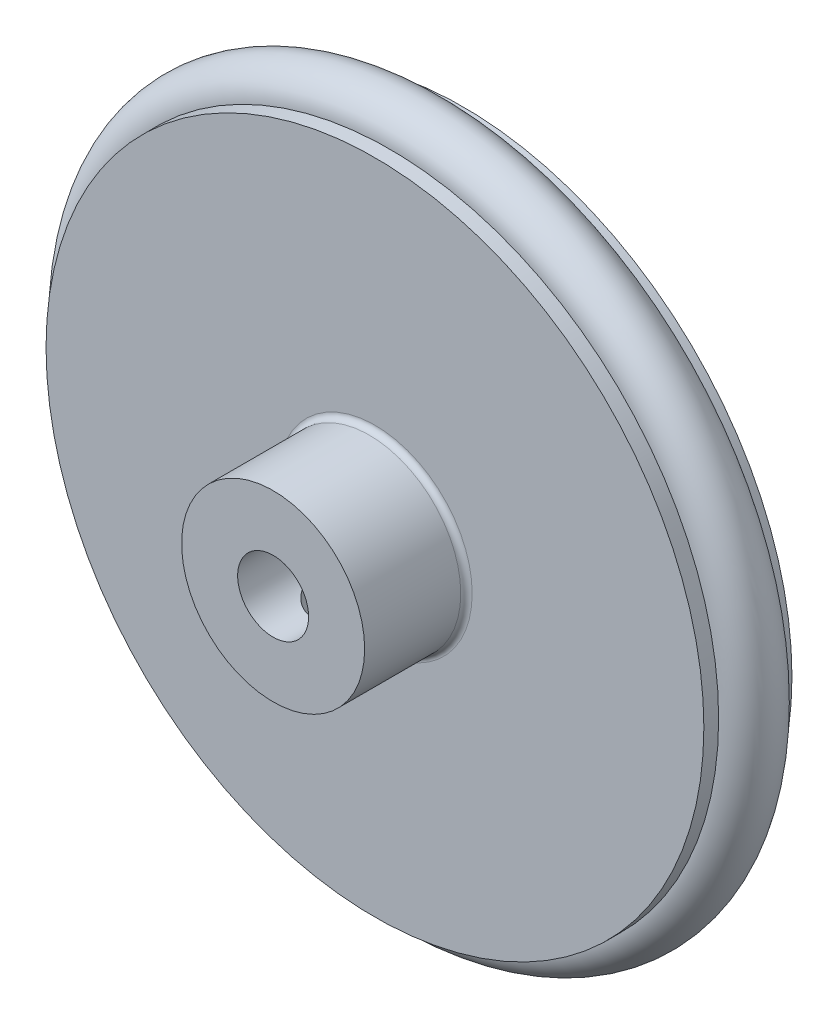
ISO-10303-21;
HEADER;
FILE_DESCRIPTION(('STEP AP214'),'2;1');
FILE_NAME('part.step','',(''),(''),'','','');
FILE_SCHEMA(('AUTOMOTIVE_DESIGN { 1 0 10303 214 1 1 1 1 }'));
ENDSEC;
DATA;
#1=APPLICATION_CONTEXT('core data for automotive mechanical design processes');
#2=APPLICATION_PROTOCOL_DEFINITION('international standard','automotive_design',2000,#1);
#3=PRODUCT_CONTEXT('',#1,'mechanical');
#4=PRODUCT('Part','Part','',(#3));
#5=PRODUCT_RELATED_PRODUCT_CATEGORY('part','',(#4));
#6=PRODUCT_DEFINITION_FORMATION('','',#4);
#7=PRODUCT_DEFINITION_CONTEXT('part definition',#1,'design');
#8=PRODUCT_DEFINITION('design','',#6,#7);
#9=PRODUCT_DEFINITION_SHAPE('','',#8);
#10=(LENGTH_UNIT() NAMED_UNIT(*) SI_UNIT(.MILLI.,.METRE.));
#11=(NAMED_UNIT(*) PLANE_ANGLE_UNIT() SI_UNIT($,.RADIAN.));
#12=(NAMED_UNIT(*) SI_UNIT($,.STERADIAN.) SOLID_ANGLE_UNIT());
#13=UNCERTAINTY_MEASURE_WITH_UNIT(LENGTH_MEASURE(1.E-05),#10,'distance_accuracy_value','');
#14=(GEOMETRIC_REPRESENTATION_CONTEXT(3) GLOBAL_UNCERTAINTY_ASSIGNED_CONTEXT((#13)) GLOBAL_UNIT_ASSIGNED_CONTEXT((#10,
#11,#12)) REPRESENTATION_CONTEXT('',''));
#15=CARTESIAN_POINT('',(0.,0.,0.));
#16=DIRECTION('',(0.,0.,1.));
#17=DIRECTION('',(1.,0.,0.));
#18=AXIS2_PLACEMENT_3D('',#15,#16,#17);
#19=CARTESIAN_POINT('',(0.,0.,0.));
#20=DIRECTION('',(0.,0.,-1.));
#21=DIRECTION('',(-1.,0.,0.));
#22=AXIS2_PLACEMENT_3D('',#19,#20,#21);
#23=TOROIDAL_SURFACE('',#22,28.75,2.56123692555145);
#24=CARTESIAN_POINT('',(28.75,0.,0.));
#25=DIRECTION('',(0.,1.,0.));
#26=DIRECTION('',(0.,0.,1.));
#27=AXIS2_PLACEMENT_3D('',#24,#25,#26);
#28=CIRCLE('',#27,2.56123692555145);
#29=CARTESIAN_POINT('',(31.3112369255514,0.,0.));
#30=VERTEX_POINT('',#29);
#31=EDGE_CURVE('E11',#30,#30,#28,.T.);
#32=CARTESIAN_POINT('',(0.,0.,0.));
#33=DIRECTION('',(0.,0.,-1.));
#34=DIRECTION('',(-1.,0.,0.));
#35=AXIS2_PLACEMENT_3D('',#32,#33,#34);
#36=CIRCLE('',#35,31.3112369255515);
#37=EDGE_CURVE('',#30,#30,#36,.T.);
#38=ORIENTED_EDGE('',*,*,#31,.F.);
#39=ORIENTED_EDGE('',*,*,#31,.T.);
#40=ORIENTED_EDGE('',*,*,#37,.T.);
#41=ORIENTED_EDGE('',*,*,#37,.F.);
#42=EDGE_LOOP('',(#38,#40,#39,#41));
#43=FACE_BOUND('',#42,.T.);
#44=ADVANCED_FACE('F52',(#43),#23,.T.);
#45=CLOSED_SHELL('',(#44));
#46=MANIFOLD_SOLID_BREP('B2',#45);
#47=CARTESIAN_POINT('',(0.,0.,3.85));
#48=DIRECTION('',(0.,0.,-1.));
#49=DIRECTION('',(-1.,0.,0.));
#50=AXIS2_PLACEMENT_3D('',#47,#48,#49);
#51=CYLINDRICAL_SURFACE('',#50,28.75);
#52=CARTESIAN_POINT('',(0.,0.,2.55));
#53=DIRECTION('',(0.,0.,-1.));
#54=DIRECTION('',(-1.,0.,0.));
#55=AXIS2_PLACEMENT_3D('',#52,#53,#54);
#56=CIRCLE('',#55,28.75);
#57=CARTESIAN_POINT('',(28.75,0.,2.55));
#58=VERTEX_POINT('',#57);
#59=EDGE_CURVE('E93',#58,#58,#56,.F.);
#60=ORIENTED_EDGE('',*,*,#59,.T.);
#61=EDGE_LOOP('',(#60));
#62=FACE_BOUND('',#61,.T.);
#63=CARTESIAN_POINT('',(0.,0.,3.85));
#64=DIRECTION('',(0.,0.,1.));
#65=DIRECTION('',(1.,0.,0.));
#66=AXIS2_PLACEMENT_3D('',#63,#64,#65);
#67=CIRCLE('',#66,28.75);
#68=CARTESIAN_POINT('',(28.75,0.,3.85));
#69=VERTEX_POINT('',#68);
#70=EDGE_CURVE('E101',#69,#69,#67,.T.);
#71=ORIENTED_EDGE('',*,*,#70,.F.);
#72=EDGE_LOOP('',(#71));
#73=FACE_BOUND('',#72,.T.);
#74=ADVANCED_FACE('F72',(#62,#73),#51,.T.);
#75=CARTESIAN_POINT('',(0.,0.,3.85));
#76=DIRECTION('',(0.,0.,1.));
#77=DIRECTION('',(1.,0.,0.));
#78=AXIS2_PLACEMENT_3D('',#75,#76,#77);
#79=PLANE('',#78);
#80=CARTESIAN_POINT('',(0.,0.,3.85));
#81=DIRECTION('',(0.,0.,1.));
#82=DIRECTION('',(1.,0.,0.));
#83=AXIS2_PLACEMENT_3D('',#80,#81,#82);
#84=CIRCLE('',#83,8.5);
#85=CARTESIAN_POINT('',(8.5,0.,3.85));
#86=VERTEX_POINT('',#85);
#87=EDGE_CURVE('E50',#86,#86,#84,.F.);
#88=ORIENTED_EDGE('',*,*,#87,.T.);
#89=EDGE_LOOP('',(#88));
#90=FACE_BOUND('',#89,.T.);
#91=ORIENTED_EDGE('',*,*,#70,.T.);
#92=EDGE_LOOP('',(#91));
#93=FACE_BOUND('',#92,.T.);
#94=ADVANCED_FACE('F153',(#90,#93),#79,.T.);
#95=CARTESIAN_POINT('',(0.,0.,0.));
#96=DIRECTION('',(0.,0.,1.));
#97=DIRECTION('',(1.,0.,0.));
#98=AXIS2_PLACEMENT_3D('',#95,#96,#97);
#99=TOROIDAL_SURFACE('',#98,28.75,2.55);
#100=CARTESIAN_POINT('',(28.75,0.,0.));
#101=DIRECTION('',(0.,1.,0.));
#102=DIRECTION('',(0.,0.,1.));
#103=AXIS2_PLACEMENT_3D('',#100,#101,#102);
#104=CIRCLE('',#103,2.55);
#105=CARTESIAN_POINT('',(28.75,0.,-2.55));
#106=VERTEX_POINT('',#105);
#107=EDGE_CURVE('E88',#106,#58,#104,.T.);
#108=ORIENTED_EDGE('',*,*,#107,.F.);
#109=CARTESIAN_POINT('',(0.,0.,-2.55));
#110=DIRECTION('',(0.,0.,1.));
#111=DIRECTION('',(1.,0.,0.));
#112=AXIS2_PLACEMENT_3D('',#109,#110,#111);
#113=CIRCLE('',#112,28.75);
#114=EDGE_CURVE('E91',#106,#106,#113,.F.);
#115=ORIENTED_EDGE('',*,*,#114,.F.);
#116=ORIENTED_EDGE('',*,*,#107,.T.);
#117=ORIENTED_EDGE('',*,*,#59,.F.);
#118=EDGE_LOOP('',(#108,#115,#116,#117));
#119=FACE_BOUND('',#118,.T.);
#120=ADVANCED_FACE('F89',(#119),#99,.F.);
#121=CARTESIAN_POINT('',(0.,0.,-3.85));
#122=DIRECTION('',(0.,0.,1.));
#123=DIRECTION('',(1.,0.,0.));
#124=AXIS2_PLACEMENT_3D('',#121,#122,#123);
#125=PLANE('',#124);
#126=CARTESIAN_POINT('',(0.,0.,-3.85));
#127=DIRECTION('',(0.,0.,1.));
#128=DIRECTION('',(1.,0.,0.));
#129=AXIS2_PLACEMENT_3D('',#126,#127,#128);
#130=CIRCLE('',#129,28.75);
#131=CARTESIAN_POINT('',(28.75,0.,-3.85));
#132=VERTEX_POINT('',#131);
#133=EDGE_CURVE('E95',#132,#132,#130,.T.);
#134=ORIENTED_EDGE('',*,*,#133,.F.);
#135=EDGE_LOOP('',(#134));
#136=FACE_BOUND('',#135,.T.);
#137=ADVANCED_FACE('F152',(#136),#125,.F.);
#138=ORIENTED_EDGE('',*,*,#114,.T.);
#139=EDGE_LOOP('',(#138));
#140=FACE_BOUND('',#139,.T.);
#141=ORIENTED_EDGE('',*,*,#133,.T.);
#142=EDGE_LOOP('',(#141));
#143=FACE_BOUND('',#142,.T.);
#144=ADVANCED_FACE('F148',(#140,#143),#51,.T.);
#145=CARTESIAN_POINT('',(0.,0.,12.75));
#146=DIRECTION('',(0.,0.,-1.));
#147=DIRECTION('',(-1.,0.,0.));
#148=AXIS2_PLACEMENT_3D('',#145,#146,#147);
#149=CYLINDRICAL_SURFACE('',#148,8.);
#150=CARTESIAN_POINT('',(0.,0.,4.35));
#151=DIRECTION('',(0.,0.,1.));
#152=DIRECTION('',(1.,0.,0.));
#153=AXIS2_PLACEMENT_3D('',#150,#151,#152);
#154=CIRCLE('',#153,8.);
#155=CARTESIAN_POINT('',(8.,0.,4.35));
#156=VERTEX_POINT('',#155);
#157=EDGE_CURVE('E81',#156,#156,#154,.T.);
#158=ORIENTED_EDGE('',*,*,#157,.T.);
#159=EDGE_LOOP('',(#158));
#160=FACE_BOUND('',#159,.T.);
#161=CARTESIAN_POINT('',(0.,-8.,9.5));
#162=CARTESIAN_POINT('',(0.110501451559641,-7.9999981315735,9.49999689901579));
#163=CARTESIAN_POINT('',(0.221037543774351,-7.99768770842435,9.49081126563495));
#164=CARTESIAN_POINT('',(0.438941765027377,-7.98869485106526,9.45436646492399));
#165=CARTESIAN_POINT('',(0.546308062494319,-7.98200993893301,9.42709705394953));
#166=CARTESIAN_POINT('',(0.754694496243435,-7.96500835109376,9.35541432871722));
#167=CARTESIAN_POINT('',(0.855722084573336,-7.95469603789411,9.31102160171297));
#168=CARTESIAN_POINT('',(1.04889617587257,-7.93153791743495,9.20642481327354));
#169=CARTESIAN_POINT('',(1.14104237913168,-7.91869202472209,9.14622021850805));
#170=CARTESIAN_POINT('',(1.31573590306789,-7.89156551455591,9.01039894712776));
#171=CARTESIAN_POINT('',(1.39807425341474,-7.87726276197502,8.93451790005459));
#172=CARTESIAN_POINT('',(1.54899856960443,-7.84898160157248,8.77006372678795));
#173=CARTESIAN_POINT('',(1.61758298259892,-7.83500323053157,8.68148916940408));
#174=CARTESIAN_POINT('',(1.74003539039863,-7.80873034264225,8.49253969768401));
#175=CARTESIAN_POINT('',(1.79366962123352,-7.79646392619748,8.39200902558836));
#176=CARTESIAN_POINT('',(1.88319587806766,-7.77532659757355,8.18300211778662));
#177=CARTESIAN_POINT('',(1.91909074058685,-7.76645514259225,8.07452715555731));
#178=CARTESIAN_POINT('',(1.97140644907302,-7.7533396892843,7.85500866906446));
#179=CARTESIAN_POINT('',(1.98820302444274,-7.74900654662681,7.74406013861601));
#180=CARTESIAN_POINT('',(2.00301570008854,-7.74519149946122,7.52084190800087));
#181=CARTESIAN_POINT('',(2.00103485575748,-7.74570880570571,7.40857242574382));
#182=CARTESIAN_POINT('',(1.97864869951961,-7.75145607355756,7.1887789230062));
#183=CARTESIAN_POINT('',(1.95869112025418,-7.75657150676391,7.08120583804623));
#184=CARTESIAN_POINT('',(1.90163224920399,-7.77075612894758,6.87098526545192));
#185=CARTESIAN_POINT('',(1.86452973609252,-7.77982559958985,6.76833812929477));
#186=CARTESIAN_POINT('',(1.77385263724958,-7.80100151874212,6.56968264499716));
#187=CARTESIAN_POINT('',(1.72011555631056,-7.81313769959755,6.47375177094724));
#188=CARTESIAN_POINT('',(1.59780836801993,-7.83906281127988,6.29210838699091));
#189=CARTESIAN_POINT('',(1.52923566507845,-7.85285203112837,6.20639766924367));
#190=CARTESIAN_POINT('',(1.37688456624163,-7.88101174053188,6.04506184574079));
#191=CARTESIAN_POINT('',(1.29272834422115,-7.89538759304001,5.96979401325153));
#192=CARTESIAN_POINT('',(1.11281589000493,-7.92274620771675,5.8343716767148));
#193=CARTESIAN_POINT('',(1.01705930361059,-7.93572892732543,5.77421763431525));
#194=CARTESIAN_POINT('',(0.816154518241855,-7.9589030945892,5.67059921836749));
#195=CARTESIAN_POINT('',(0.710975190944831,-7.96908480170303,5.62719287966076));
#196=CARTESIAN_POINT('',(0.49450134419051,-7.98543889321888,5.55877692572057));
#197=CARTESIAN_POINT('',(0.383207998867312,-7.99161204452374,5.53376379144248));
#198=CARTESIAN_POINT('',(0.160719960520035,-7.999139990285,5.50338991258822));
#199=CARTESIAN_POINT('',(0.0495956266509452,-8.00061404677705,5.4975426318996));
#200=CARTESIAN_POINT('',(-0.172043833068678,-7.99891739752601,5.50433200274065));
#201=CARTESIAN_POINT('',(-0.282559012859461,-7.99574710989128,5.51696699039884));
#202=CARTESIAN_POINT('',(-0.498152358368656,-7.98519441503143,5.55996121118851));
#203=CARTESIAN_POINT('',(-0.603286825291673,-7.97787512247748,5.59005501796932));
#204=CARTESIAN_POINT('',(-0.807009723270016,-7.95984942178845,5.66680944537126));
#205=CARTESIAN_POINT('',(-0.905597492043513,-7.94914267159856,5.71347173908423));
#206=CARTESIAN_POINT('',(-1.0953641792398,-7.92524410568414,5.82298150516631));
#207=CARTESIAN_POINT('',(-1.18638058911444,-7.91201156489243,5.88610148319569));
#208=CARTESIAN_POINT('',(-1.35670215152433,-7.88459345583226,6.02638654506263));
#209=CARTESIAN_POINT('',(-1.43600527863068,-7.87040772335606,6.10355405282254));
#210=CARTESIAN_POINT('',(-1.58265409076364,-7.84225275947695,6.27200261445929));
#211=CARTESIAN_POINT('',(-1.64965849016271,-7.82829738916375,6.36358360400323));
#212=CARTESIAN_POINT('',(-1.7673476786836,-7.80257171169652,6.55697684595429));
#213=CARTESIAN_POINT('',(-1.81803319221058,-7.79080130756035,6.65878864394634));
#214=CARTESIAN_POINT('',(-1.90126856081239,-7.77090792979553,6.86920762988411));
#215=CARTESIAN_POINT('',(-1.93392586220542,-7.76276340389207,6.97777017112535));
#216=CARTESIAN_POINT('',(-1.98046087993837,-7.75102325453578,7.19907951718548));
#217=CARTESIAN_POINT('',(-1.99434270330488,-7.74742663626581,7.31182540137666));
#218=CARTESIAN_POINT('',(-2.00271812044533,-7.74526534938609,7.53482803180694));
#219=CARTESIAN_POINT('',(-1.99775719704016,-7.74655910304352,7.64506324683298));
#220=CARTESIAN_POINT('',(-1.96983637108382,-7.7537054534379,7.86307185155731));
#221=CARTESIAN_POINT('',(-1.94687683024903,-7.75955795855809,7.97084529068487));
#222=CARTESIAN_POINT('',(-1.88390842592373,-7.77508347576963,8.18027794542055));
#223=CARTESIAN_POINT('',(-1.84400187290717,-7.78473353648412,8.28196974032028));
#224=CARTESIAN_POINT('',(-1.74835321814009,-7.80677007633105,8.47728717695159));
#225=CARTESIAN_POINT('',(-1.69260892004558,-7.81915693494364,8.57091169758256));
#226=CARTESIAN_POINT('',(-1.56515699818285,-7.8456751235135,8.75007283866936));
#227=CARTESIAN_POINT('',(-1.493070883883,-7.85984353109009,8.83533476456528));
#228=CARTESIAN_POINT('',(-1.33571916158631,-7.88810702995048,8.99272939306054));
#229=CARTESIAN_POINT('',(-1.25045042834819,-7.90220210302746,9.06485897348396));
#230=CARTESIAN_POINT('',(-1.06729011560345,-7.92903540863551,9.19521507808614));
#231=CARTESIAN_POINT('',(-0.969197896421848,-7.94174444487824,9.25316615156211));
#232=CARTESIAN_POINT('',(-0.764354746013967,-7.96406566633491,9.35166328392071));
#233=CARTESIAN_POINT('',(-0.657610084582319,-7.97368006933042,9.39222181419805));
#234=CARTESIAN_POINT('',(-0.459213670991295,-7.98730746087389,9.44876244043954));
#235=CARTESIAN_POINT('',(-0.368506894544092,-7.9920344673692,9.46793499073791));
#236=CARTESIAN_POINT('',(-0.185208095381711,-7.99838140309264,9.49355459149592));
#237=CARTESIAN_POINT('',(-0.0926162149901552,-8.00000156601192,9.50000259907373));
#238=CARTESIAN_POINT('',(0.,-8.,9.5));
#239=B_SPLINE_CURVE_WITH_KNOTS('',3,(#161,#162,#163,#164,#165,#166,#167,#168,#169,#170,#171,
#172,#173,#174,#175,#176,#177,#178,#179,#180,#181,#182,#183,#184,#185,#186,#187,#188,#189,#190,
#191,#192,#193,#194,#195,#196,#197,#198,#199,#200,#201,#202,#203,#204,#205,#206,#207,#208,#209,
#210,#211,#212,#213,#214,#215,#216,#217,#218,#219,#220,#221,#222,#223,#224,#225,#226,#227,#228,
#229,#230,#231,#232,#233,#234,#235,#236,#237,#238),.UNSPECIFIED.,.T.,.F.,(4,2,2,2,2,2,2,2,2,2,2,
2,2,2,2,2,2,2,2,2,2,2,2,2,2,2,2,2,2,2,2,2,2,2,2,2,2,2,4),(0.,0.331164949962519,
0.662517650351866,0.993473203048141,1.32443992022577,1.66152580582852,1.99864972773416,
2.34078196727742,2.68285948225824,3.01808393468093,3.3532538415469,3.68029996013785,
4.00736937959146,4.337740371696,4.66816921119311,5.00802001296453,5.34788119415424,
5.6889097201658,6.02987298255951,6.36211078603463,6.69431868154752,7.02160366023144,
7.34892169767482,7.68204783424897,8.01523150681786,8.35659345610396,8.69794025003772,
9.03723006156476,9.37644564340971,9.70591707202578,10.0353818794581,10.3628853408369,
10.6904342418696,11.0265276855097,11.3627009303165,11.7049624733721,12.0469781843289,
12.3245632392729,12.6021274139515),.UNSPECIFIED.);
#240=CARTESIAN_POINT('',(0.,-8.,9.5));
#241=VERTEX_POINT('',#240);
#242=EDGE_CURVE('E123',#241,#241,#239,.T.);
#243=ORIENTED_EDGE('',*,*,#242,.T.);
#244=EDGE_LOOP('',(#243));
#245=FACE_BOUND('',#244,.T.);
#246=CARTESIAN_POINT('',(0.,0.,12.75));
#247=DIRECTION('',(0.,0.,1.));
#248=DIRECTION('',(1.,0.,0.));
#249=AXIS2_PLACEMENT_3D('',#246,#247,#248);
#250=CIRCLE('',#249,8.);
#251=CARTESIAN_POINT('',(8.,0.,12.75));
#252=VERTEX_POINT('',#251);
#253=EDGE_CURVE('E96',#252,#252,#250,.T.);
#254=ORIENTED_EDGE('',*,*,#253,.F.);
#255=EDGE_LOOP('',(#254));
#256=FACE_BOUND('',#255,.T.);
#257=ADVANCED_FACE('F143',(#160,#245,#256),#149,.T.);
#258=CARTESIAN_POINT('',(0.,0.,12.75));
#259=DIRECTION('',(0.,0.,1.));
#260=DIRECTION('',(1.,0.,0.));
#261=AXIS2_PLACEMENT_3D('',#258,#259,#260);
#262=PLANE('',#261);
#263=CARTESIAN_POINT('',(0.,0.,12.75));
#264=DIRECTION('',(0.,0.,1.));
#265=DIRECTION('',(1.,0.,0.));
#266=AXIS2_PLACEMENT_3D('',#263,#264,#265);
#267=CIRCLE('',#266,3.1);
#268=CARTESIAN_POINT('',(3.1,0.,12.75));
#269=VERTEX_POINT('',#268);
#270=EDGE_CURVE('E142',#269,#269,#267,.T.);
#271=ORIENTED_EDGE('',*,*,#270,.F.);
#272=EDGE_LOOP('',(#271));
#273=FACE_BOUND('',#272,.T.);
#274=ORIENTED_EDGE('',*,*,#253,.T.);
#275=EDGE_LOOP('',(#274));
#276=FACE_BOUND('',#275,.T.);
#277=ADVANCED_FACE('F147',(#273,#276),#262,.T.);
#278=CARTESIAN_POINT('',(0.,0.,-12.6181240867132));
#279=DIRECTION('',(0.,0.,1.));
#280=DIRECTION('',(1.,0.,0.));
#281=AXIS2_PLACEMENT_3D('',#278,#279,#280);
#282=CYLINDRICAL_SURFACE('',#281,3.1);
#283=CARTESIAN_POINT('',(0.,-3.1,9.5));
#284=CARTESIAN_POINT('',(-0.101091385039777,-3.09999460939274,9.49999423985456));
#285=CARTESIAN_POINT('',(-0.202236134564494,-3.09500777365122,9.49228861003426));
#286=CARTESIAN_POINT('',(-0.40134422219677,-3.07554251080367,9.46191052513201));
#287=CARTESIAN_POINT('',(-0.499304337672782,-3.0610547651011,9.43922337585951));
#288=CARTESIAN_POINT('',(-0.688847609969658,-3.02403316266577,9.38023929755381));
#289=CARTESIAN_POINT('',(-0.780458562332545,-3.00153742435718,9.34400680467486));
#290=CARTESIAN_POINT('',(-0.955964244967446,-2.95033924070804,9.25944096599089));
#291=CARTESIAN_POINT('',(-1.03985843062382,-2.9216363577727,9.21110676699504));
#292=CARTESIAN_POINT('',(-1.20534975085783,-2.85755815418126,9.09934687867213));
#293=CARTESIAN_POINT('',(-1.28618869122808,-2.82182799524603,9.0350061395549));
#294=CARTESIAN_POINT('',(-1.43665631544782,-2.74828108070154,8.89520120954714));
#295=CARTESIAN_POINT('',(-1.50626924383573,-2.71046149080006,8.81972166508535));
#296=CARTESIAN_POINT('',(-1.64268679943019,-2.63034253686168,8.64691651791072));
#297=CARTESIAN_POINT('',(-1.70759476074744,-2.58819607847858,8.54801033709484));
#298=CARTESIAN_POINT('',(-1.81972592440112,-2.51062817225813,8.33825819113032));
#299=CARTESIAN_POINT('',(-1.86697956402236,-2.47519520238284,8.2274332037925));
#300=CARTESIAN_POINT('',(-1.93115046035712,-2.42525032881529,8.02768249145855));
#301=CARTESIAN_POINT('',(-1.95283049983355,-2.40766682164749,7.94106125555081));
#302=CARTESIAN_POINT('',(-1.98446592184547,-2.38166474413427,7.76441515405156));
#303=CARTESIAN_POINT('',(-1.99443957013961,-2.37323189735386,7.67439581776609));
#304=CARTESIAN_POINT('',(-2.00204983941226,-2.36681793758445,7.49315258210891));
#305=CARTESIAN_POINT('',(-1.99964615392167,-2.36887097141953,7.4019257134594));
#306=CARTESIAN_POINT('',(-1.98258006769263,-2.38316799120796,7.2214121827045));
#307=CARTESIAN_POINT('',(-1.96790747526994,-2.39542044970509,7.13212719699272));
#308=CARTESIAN_POINT('',(-1.92786567346179,-2.42774793365928,6.9607019055138));
#309=CARTESIAN_POINT('',(-1.9028579256027,-2.44755702424853,6.87842389978763));
#310=CARTESIAN_POINT('',(-1.84321796757953,-2.49277853296268,6.71910848586362));
#311=CARTESIAN_POINT('',(-1.80858257660194,-2.51819280237145,6.64207282013664));
#312=CARTESIAN_POINT('',(-1.72290696910724,-2.5777531470504,6.47940367147485));
#313=CARTESIAN_POINT('',(-1.66998346799092,-2.61263498659573,6.39503299514242));
#314=CARTESIAN_POINT('',(-1.55262072653794,-2.68404531595956,6.2354053931168));
#315=CARTESIAN_POINT('',(-1.48816769918918,-2.72057573761244,6.16015956168707));
#316=CARTESIAN_POINT('',(-1.33531850150805,-2.79921977867378,6.00641965469216));
#317=CARTESIAN_POINT('',(-1.2446991971314,-2.84108811643832,5.92998603795691));
#318=CARTESIAN_POINT('',(-1.04963410942446,-2.91877600894092,5.79342507092218));
#319=CARTESIAN_POINT('',(-0.945202988602563,-2.95460188779143,5.73328063171092));
#320=CARTESIAN_POINT('',(-0.746639365899209,-3.01014273026213,5.64204748666379));
#321=CARTESIAN_POINT('',(-0.65456737995395,-3.03164347825907,5.6075627187463));
#322=CARTESIAN_POINT('',(-0.464930213104867,-3.06644845105128,5.55229077747468));
#323=CARTESIAN_POINT('',(-0.367369568656605,-3.07975933933833,5.53149246748689));
#324=CARTESIAN_POINT('',(-0.169045410576032,-3.0969921575555,5.50463832866688));
#325=CARTESIAN_POINT('',(-0.0682718516736113,-3.10088094883133,5.49863453267088));
#326=CARTESIAN_POINT('',(0.132930127327373,-3.0987818893615,5.50188808806102));
#327=CARTESIAN_POINT('',(0.233358534619953,-3.09279367603535,5.51114599969775));
#328=CARTESIAN_POINT('',(0.425119290519885,-3.0721423509695,5.54342154508947));
#329=CARTESIAN_POINT('',(0.51664537144639,-3.05798682310753,5.56563483512585));
#330=CARTESIAN_POINT('',(0.694421792387248,-3.02258192723568,5.62210647387215));
#331=CARTESIAN_POINT('',(0.780671246170739,-3.00133137143629,5.65636683945258));
#332=CARTESIAN_POINT('',(0.952313130749649,-2.95155061853353,5.73852436888356));
#333=CARTESIAN_POINT('',(1.03719832856589,-2.92260695610669,5.78722473299525));
#334=CARTESIAN_POINT('',(1.19797699917457,-2.86047105425269,5.89554882406114));
#335=CARTESIAN_POINT('',(1.27386369806246,-2.82727565280704,5.95518069515739));
#336=CARTESIAN_POINT('',(1.42679573254823,-2.75363680286679,6.09411453626771));
#337=CARTESIAN_POINT('',(1.502217991591,-2.71286465557268,6.17503157595802));
#338=CARTESIAN_POINT('',(1.63901758369639,-2.63247341235496,6.34855184705935));
#339=CARTESIAN_POINT('',(1.70039095540679,-2.59285464439052,6.44115836314992));
#340=CARTESIAN_POINT('',(1.80081056775826,-2.5239466231388,6.62446981638804));
#341=CARTESIAN_POINT('',(1.84170928019883,-2.49398430191481,6.71390042775378));
#342=CARTESIAN_POINT('',(1.91037132253394,-2.44179234650511,6.8997766615712));
#343=CARTESIAN_POINT('',(1.93815244113827,-2.41955225114483,6.99621257806556));
#344=CARTESIAN_POINT('',(1.97925302886152,-2.38606269457456,7.19512500607156));
#345=CARTESIAN_POINT('',(1.99242553477726,-2.37492503520893,7.29765216173333));
#346=CARTESIAN_POINT('',(2.00265608987801,-2.36631138405995,7.50404792910151));
#347=CARTESIAN_POINT('',(1.99972843393145,-2.36882327321338,7.60791526916267));
#348=CARTESIAN_POINT('',(1.97974948336216,-2.385519162785,7.79704235785586));
#349=CARTESIAN_POINT('',(1.96492208911016,-2.39786312632663,7.88272249216542));
#350=CARTESIAN_POINT('',(1.92478575684782,-2.43019785844483,8.05010808712704));
#351=CARTESIAN_POINT('',(1.8994662269818,-2.45019635274102,8.13180943777216));
#352=CARTESIAN_POINT('',(1.8289643349275,-2.50348562062322,8.31720982840996));
#353=CARTESIAN_POINT('',(1.77994565236697,-2.53898245001553,8.41881180681012));
#354=CARTESIAN_POINT('',(1.66665742988777,-2.61474699558477,8.61119491391551));
#355=CARTESIAN_POINT('',(1.60236450988041,-2.65502197783671,8.70195913016394));
#356=CARTESIAN_POINT('',(1.45888519845899,-2.73652246794838,8.87267718655171));
#357=CARTESIAN_POINT('',(1.37951440481604,-2.77775351345464,8.95247350407429));
#358=CARTESIAN_POINT('',(1.20753038667599,-2.85671179204102,9.09829677390185));
#359=CARTESIAN_POINT('',(1.11492957876487,-2.89444225631806,9.16433649573719));
#360=CARTESIAN_POINT('',(0.930076713789365,-2.95860078482454,9.27341698597728));
#361=CARTESIAN_POINT('',(0.839194900302701,-2.98584930398292,9.318291150779));
#362=CARTESIAN_POINT('',(0.650002847052295,-3.03264637260129,9.39415954682018));
#363=CARTESIAN_POINT('',(0.551704291854859,-3.05220674429459,9.42517509888306));
#364=CARTESIAN_POINT('',(0.377584832422472,-3.07781554283967,9.46548062779998));
#365=CARTESIAN_POINT('',(0.30291009649643,-3.08609090810034,9.47838335273191));
#366=CARTESIAN_POINT('',(0.15216703635602,-3.09718531112089,9.49564543467788));
#367=CARTESIAN_POINT('',(0.0760986380390963,-3.10000405789149,9.50000433606902));
#368=CARTESIAN_POINT('',(0.,-3.1,9.5));
#369=B_SPLINE_CURVE_WITH_KNOTS('',3,(#283,#284,#285,#286,#287,#288,#289,#290,#291,#292,#293,
#294,#295,#296,#297,#298,#299,#300,#301,#302,#303,#304,#305,#306,#307,#308,#309,#310,#311,#312,
#313,#314,#315,#316,#317,#318,#319,#320,#321,#322,#323,#324,#325,#326,#327,#328,#329,#330,#331,
#332,#333,#334,#335,#336,#337,#338,#339,#340,#341,#342,#343,#344,#345,#346,#347,#348,#349,#350,
#351,#352,#353,#354,#355,#356,#357,#358,#359,#360,#361,#362,#363,#364,#365,#366,#367,#368),
.UNSPECIFIED.,.T.,.F.,(4,2,2,2,2,2,2,2,2,2,2,2,2,2,2,2,2,2,2,2,2,2,2,2,2,2,2,2,2,2,2,2,2,2,2,2,
2,2,2,2,2,2,4),(0.,0.302966311138187,0.606230220275506,0.908069468488516,1.20993000287647,
1.53665065809857,1.86382594121082,2.23880818267474,2.61314091205647,2.88505518621458,
3.15654461969954,3.42891870954099,3.70151928342565,3.96529957222992,4.22916711345738,
4.54461288083483,4.86043841114649,5.23578572642889,5.61073772744286,5.91138256881843,
6.21178247281048,6.51323739565213,6.814703385018,7.09919018653744,7.38372463832978,
7.68871147259943,7.99392645710977,8.34616896663427,8.69851067565524,9.00574516973998,
9.31256181935081,9.62243782101927,9.9320387371862,10.1943851218243,10.4569969939451,
10.8099170659531,11.1633808690887,11.521483908107,11.8792530427354,12.1928227029758,
12.5059082759399,12.7339602929413,12.9620244711131),.UNSPECIFIED.);
#370=CARTESIAN_POINT('',(0.,-3.1,9.5));
#371=VERTEX_POINT('',#370);
#372=EDGE_CURVE('E115',#371,#371,#369,.T.);
#373=ORIENTED_EDGE('',*,*,#372,.T.);
#374=EDGE_LOOP('',(#373));
#375=FACE_BOUND('',#374,.T.);
#376=CARTESIAN_POINT('',(0.,0.,-2.85));
#377=DIRECTION('',(0.,0.,1.));
#378=DIRECTION('',(1.,0.,0.));
#379=AXIS2_PLACEMENT_3D('',#376,#377,#378);
#380=CIRCLE('',#379,3.1);
#381=CARTESIAN_POINT('',(3.1,0.,-2.85));
#382=VERTEX_POINT('',#381);
#383=EDGE_CURVE('E104',#382,#382,#380,.F.);
#384=ORIENTED_EDGE('',*,*,#383,.T.);
#385=EDGE_LOOP('',(#384));
#386=FACE_BOUND('',#385,.T.);
#387=ORIENTED_EDGE('',*,*,#270,.T.);
#388=EDGE_LOOP('',(#387));
#389=FACE_BOUND('',#388,.T.);
#390=ADVANCED_FACE('F124',(#375,#386,#389),#282,.F.);
#391=CARTESIAN_POINT('',(0.,0.,-2.85));
#392=DIRECTION('',(0.,0.,1.));
#393=DIRECTION('',(1.,0.,0.));
#394=AXIS2_PLACEMENT_3D('',#391,#392,#393);
#395=PLANE('',#394);
#396=ORIENTED_EDGE('',*,*,#383,.F.);
#397=EDGE_LOOP('',(#396));
#398=FACE_BOUND('',#397,.T.);
#399=ADVANCED_FACE('F131',(#398),#395,.T.);
#400=CARTESIAN_POINT('',(0.,-31.3112369255515,7.5));
#401=DIRECTION('',(0.,1.,0.));
#402=DIRECTION('',(0.,0.,1.));
#403=AXIS2_PLACEMENT_3D('',#400,#401,#402);
#404=CYLINDRICAL_SURFACE('',#403,2.);
#405=ORIENTED_EDGE('',*,*,#372,.F.);
#406=EDGE_LOOP('',(#405));
#407=FACE_BOUND('',#406,.T.);
#408=ORIENTED_EDGE('',*,*,#242,.F.);
#409=EDGE_LOOP('',(#408));
#410=FACE_BOUND('',#409,.T.);
#411=ADVANCED_FACE('F128',(#407,#410),#404,.F.);
#412=CARTESIAN_POINT('',(0.,0.,4.35));
#413=DIRECTION('',(0.,0.,1.));
#414=DIRECTION('',(1.,0.,0.));
#415=AXIS2_PLACEMENT_3D('',#412,#413,#414);
#416=TOROIDAL_SURFACE('',#415,8.5,0.5);
#417=ORIENTED_EDGE('',*,*,#87,.F.);
#418=EDGE_LOOP('',(#417));
#419=FACE_BOUND('',#418,.T.);
#420=ORIENTED_EDGE('',*,*,#157,.F.);
#421=EDGE_LOOP('',(#420));
#422=FACE_BOUND('',#421,.T.);
#423=ADVANCED_FACE('F74',(#419,#422),#416,.F.);
#424=CLOSED_SHELL('',(#74,#94,#120,#137,#144,#257,#277,#390,#399,#411,#423));
#425=MANIFOLD_SOLID_BREP('B6',#424);
#426=ADVANCED_BREP_SHAPE_REPRESENTATION('',(#18,#46,#425),#14);
#427=SHAPE_DEFINITION_REPRESENTATION(#9,#426);
ENDSEC;
END-ISO-10303-21;
